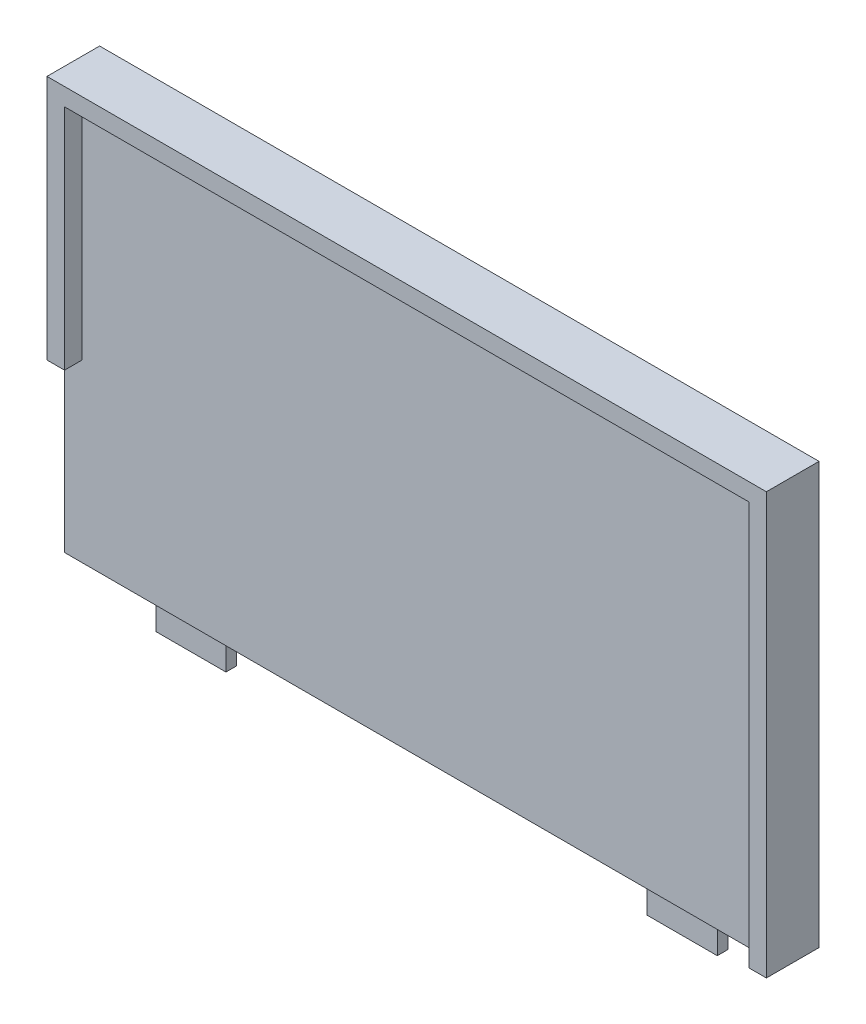
ISO-10303-21;
HEADER;
FILE_DESCRIPTION(('STEP AP214'),'2;1');
FILE_NAME('part.step','',(''),(''),'','','');
FILE_SCHEMA(('AUTOMOTIVE_DESIGN { 1 0 10303 214 1 1 1 1 }'));
ENDSEC;
DATA;
#1=APPLICATION_CONTEXT('core data for automotive mechanical design processes');
#2=APPLICATION_PROTOCOL_DEFINITION('international standard','automotive_design',2000,#1);
#3=PRODUCT_CONTEXT('',#1,'mechanical');
#4=PRODUCT('Part','Part','',(#3));
#5=PRODUCT_RELATED_PRODUCT_CATEGORY('part','',(#4));
#6=PRODUCT_DEFINITION_FORMATION('','',#4);
#7=PRODUCT_DEFINITION_CONTEXT('part definition',#1,'design');
#8=PRODUCT_DEFINITION('design','',#6,#7);
#9=PRODUCT_DEFINITION_SHAPE('','',#8);
#10=(LENGTH_UNIT() NAMED_UNIT(*) SI_UNIT(.MILLI.,.METRE.));
#11=(NAMED_UNIT(*) PLANE_ANGLE_UNIT() SI_UNIT($,.RADIAN.));
#12=(NAMED_UNIT(*) SI_UNIT($,.STERADIAN.) SOLID_ANGLE_UNIT());
#13=UNCERTAINTY_MEASURE_WITH_UNIT(LENGTH_MEASURE(1.E-05),#10,'distance_accuracy_value','');
#14=(GEOMETRIC_REPRESENTATION_CONTEXT(3) GLOBAL_UNCERTAINTY_ASSIGNED_CONTEXT((#13)) GLOBAL_UNIT_ASSIGNED_CONTEXT((#10,
#11,#12)) REPRESENTATION_CONTEXT('',''));
#15=CARTESIAN_POINT('',(0.,0.,0.));
#16=DIRECTION('',(0.,0.,1.));
#17=DIRECTION('',(1.,0.,0.));
#18=AXIS2_PLACEMENT_3D('',#15,#16,#17);
#19=CARTESIAN_POINT('',(102.5,-60.,10.));
#20=DIRECTION('',(0.,1.,0.));
#21=DIRECTION('',(0.,0.,1.));
#22=AXIS2_PLACEMENT_3D('',#19,#20,#21);
#23=PLANE('',#22);
#24=DIRECTION('',(0.,0.,1.));
#25=VECTOR('',#24,1.);
#26=CARTESIAN_POINT('',(80.,-60.,3.49633402895119));
#27=LINE('',#26,#25);
#28=CARTESIAN_POINT('',(80.,-60.,3.49633402895119));
#29=VERTEX_POINT('',#28);
#30=CARTESIAN_POINT('',(79.9999999999999,-60.,6.49633402895119));
#31=VERTEX_POINT('',#30);
#32=EDGE_CURVE('E235',#29,#31,#27,.T.);
#33=ORIENTED_EDGE('',*,*,#32,.F.);
#34=DIRECTION('',(1.,0.,0.));
#35=VECTOR('',#34,1.);
#36=CARTESIAN_POINT('',(80.,-60.,3.49633402895119));
#37=LINE('',#36,#35);
#38=CARTESIAN_POINT('',(60.,-60.,3.49633402895119));
#39=VERTEX_POINT('',#38);
#40=EDGE_CURVE('E224',#39,#29,#37,.T.);
#41=ORIENTED_EDGE('',*,*,#40,.F.);
#42=DIRECTION('',(0.,0.,-1.));
#43=VECTOR('',#42,1.);
#44=CARTESIAN_POINT('',(60.,-60.,3.49633402895119));
#45=LINE('',#44,#43);
#46=CARTESIAN_POINT('',(60.,-60.,6.49633402895119));
#47=VERTEX_POINT('',#46);
#48=EDGE_CURVE('E228',#47,#39,#45,.T.);
#49=ORIENTED_EDGE('',*,*,#48,.F.);
#50=DIRECTION('',(-1.,0.,0.));
#51=VECTOR('',#50,1.);
#52=CARTESIAN_POINT('',(79.9999999999999,-60.,6.49633402895119));
#53=LINE('',#52,#51);
#54=EDGE_CURVE('E229',#31,#47,#53,.T.);
#55=ORIENTED_EDGE('',*,*,#54,.F.);
#56=EDGE_LOOP('',(#33,#41,#49,#55));
#57=FACE_BOUND('',#56,.T.);
#58=DIRECTION('',(1.,0.,0.));
#59=VECTOR('',#58,1.);
#60=CARTESIAN_POINT('',(102.5,-60.,0.));
#61=LINE('',#60,#59);
#62=CARTESIAN_POINT('',(-102.5,-60.,0.));
#63=VERTEX_POINT('',#62);
#64=CARTESIAN_POINT('',(102.5,-60.,0.));
#65=VERTEX_POINT('',#64);
#66=EDGE_CURVE('E328',#63,#65,#61,.T.);
#67=ORIENTED_EDGE('',*,*,#66,.T.);
#68=DIRECTION('',(0.,0.,-1.));
#69=VECTOR('',#68,1.);
#70=CARTESIAN_POINT('',(102.5,-60.,10.));
#71=LINE('',#70,#69);
#72=CARTESIAN_POINT('',(102.5,-60.,15.));
#73=VERTEX_POINT('',#72);
#74=EDGE_CURVE('E331',#73,#65,#71,.T.);
#75=ORIENTED_EDGE('',*,*,#74,.F.);
#76=DIRECTION('',(1.,0.,0.));
#77=VECTOR('',#76,1.);
#78=CARTESIAN_POINT('',(102.5,-60.,15.));
#79=LINE('',#78,#77);
#80=CARTESIAN_POINT('',(97.5,-60.,15.));
#81=VERTEX_POINT('',#80);
#82=EDGE_CURVE('E287',#81,#73,#79,.T.);
#83=ORIENTED_EDGE('',*,*,#82,.F.);
#84=DIRECTION('',(0.,0.,-1.));
#85=VECTOR('',#84,1.);
#86=CARTESIAN_POINT('',(97.5,-60.,15.));
#87=LINE('',#86,#85);
#88=CARTESIAN_POINT('',(97.5,-60.,10.));
#89=VERTEX_POINT('',#88);
#90=EDGE_CURVE('E291',#81,#89,#87,.T.);
#91=ORIENTED_EDGE('',*,*,#90,.T.);
#92=DIRECTION('',(1.,0.,0.));
#93=VECTOR('',#92,1.);
#94=CARTESIAN_POINT('',(102.5,-60.,10.));
#95=LINE('',#94,#93);
#96=CARTESIAN_POINT('',(-102.5,-60.,10.));
#97=VERTEX_POINT('',#96);
#98=EDGE_CURVE('E321',#97,#89,#95,.T.);
#99=ORIENTED_EDGE('',*,*,#98,.F.);
#100=DIRECTION('',(0.,0.,-1.));
#101=VECTOR('',#100,1.);
#102=CARTESIAN_POINT('',(-102.5,-60.,10.));
#103=LINE('',#102,#101);
#104=EDGE_CURVE('E50',#97,#63,#103,.T.);
#105=ORIENTED_EDGE('',*,*,#104,.T.);
#106=EDGE_LOOP('',(#67,#75,#83,#91,#99,#105));
#107=FACE_BOUND('',#106,.T.);
#108=DIRECTION('',(0.,0.,1.));
#109=VECTOR('',#108,1.);
#110=CARTESIAN_POINT('',(-60.,-60.,3.49633402895075));
#111=LINE('',#110,#109);
#112=CARTESIAN_POINT('',(-60.,-60.,3.49633402895075));
#113=VERTEX_POINT('',#112);
#114=CARTESIAN_POINT('',(-60.,-60.,6.49633402895075));
#115=VERTEX_POINT('',#114);
#116=EDGE_CURVE('E53',#113,#115,#111,.T.);
#117=ORIENTED_EDGE('',*,*,#116,.F.);
#118=DIRECTION('',(1.,0.,0.));
#119=VECTOR('',#118,1.);
#120=CARTESIAN_POINT('',(-80.,-60.,3.49633402895075));
#121=LINE('',#120,#119);
#122=CARTESIAN_POINT('',(-80.,-60.,3.49633402895075));
#123=VERTEX_POINT('',#122);
#124=EDGE_CURVE('E59',#123,#113,#121,.T.);
#125=ORIENTED_EDGE('',*,*,#124,.F.);
#126=DIRECTION('',(0.,0.,-1.));
#127=VECTOR('',#126,1.);
#128=CARTESIAN_POINT('',(-80.,-60.,3.49633402895075));
#129=LINE('',#128,#127);
#130=CARTESIAN_POINT('',(-80.,-60.,6.49633402895075));
#131=VERTEX_POINT('',#130);
#132=EDGE_CURVE('E624',#131,#123,#129,.T.);
#133=ORIENTED_EDGE('',*,*,#132,.F.);
#134=DIRECTION('',(-1.,0.,0.));
#135=VECTOR('',#134,1.);
#136=CARTESIAN_POINT('',(-80.,-60.,6.49633402895075));
#137=LINE('',#136,#135);
#138=EDGE_CURVE('E629',#115,#131,#137,.T.);
#139=ORIENTED_EDGE('',*,*,#138,.F.);
#140=EDGE_LOOP('',(#117,#125,#133,#139));
#141=FACE_BOUND('',#140,.T.);
#142=ADVANCED_FACE('F39',(#57,#107,#141),#23,.F.);
#143=CARTESIAN_POINT('',(0.,0.,10.));
#144=DIRECTION('',(0.,0.,-1.));
#145=DIRECTION('',(-1.,0.,0.));
#146=AXIS2_PLACEMENT_3D('',#143,#144,#145);
#147=PLANE('',#146);
#148=DIRECTION('',(0.,-1.,0.));
#149=VECTOR('',#148,1.);
#150=CARTESIAN_POINT('',(97.5,-60.,10.));
#151=LINE('',#150,#149);
#152=CARTESIAN_POINT('',(97.5,55.,10.));
#153=VERTEX_POINT('',#152);
#154=EDGE_CURVE('E280',#153,#89,#151,.T.);
#155=ORIENTED_EDGE('',*,*,#154,.F.);
#156=DIRECTION('',(1.,0.,0.));
#157=VECTOR('',#156,1.);
#158=CARTESIAN_POINT('',(97.5,55.,10.));
#159=LINE('',#158,#157);
#160=CARTESIAN_POINT('',(-97.4999999999999,55.,10.));
#161=VERTEX_POINT('',#160);
#162=EDGE_CURVE('E297',#161,#153,#159,.T.);
#163=ORIENTED_EDGE('',*,*,#162,.F.);
#164=DIRECTION('',(0.,1.,0.));
#165=VECTOR('',#164,1.);
#166=CARTESIAN_POINT('',(-97.5,-10.,10.));
#167=LINE('',#166,#165);
#168=CARTESIAN_POINT('',(-97.5,-10.,10.));
#169=VERTEX_POINT('',#168);
#170=EDGE_CURVE('E298',#169,#161,#167,.T.);
#171=ORIENTED_EDGE('',*,*,#170,.F.);
#172=DIRECTION('',(1.,0.,0.));
#173=VECTOR('',#172,1.);
#174=CARTESIAN_POINT('',(-102.5,-10.,10.));
#175=LINE('',#174,#173);
#176=CARTESIAN_POINT('',(-102.5,-10.,10.));
#177=VERTEX_POINT('',#176);
#178=EDGE_CURVE('E266',#177,#169,#175,.T.);
#179=ORIENTED_EDGE('',*,*,#178,.F.);
#180=DIRECTION('',(0.,-1.,0.));
#181=VECTOR('',#180,1.);
#182=CARTESIAN_POINT('',(-102.5,-60.,10.));
#183=LINE('',#182,#181);
#184=EDGE_CURVE('E317',#177,#97,#183,.T.);
#185=ORIENTED_EDGE('',*,*,#184,.T.);
#186=ORIENTED_EDGE('',*,*,#98,.T.);
#187=EDGE_LOOP('',(#155,#163,#171,#179,#185,#186));
#188=FACE_BOUND('',#187,.T.);
#189=ADVANCED_FACE('F362',(#188),#147,.F.);
#190=CARTESIAN_POINT('',(102.5,60.,10.));
#191=DIRECTION('',(0.,-1.,0.));
#192=DIRECTION('',(0.,0.,-1.));
#193=AXIS2_PLACEMENT_3D('',#190,#191,#192);
#194=PLANE('',#193);
#195=DIRECTION('',(-1.,0.,0.));
#196=VECTOR('',#195,1.);
#197=CARTESIAN_POINT('',(102.5,60.,0.));
#198=LINE('',#197,#196);
#199=CARTESIAN_POINT('',(102.5,60.,0.));
#200=VERTEX_POINT('',#199);
#201=CARTESIAN_POINT('',(-102.5,60.,0.));
#202=VERTEX_POINT('',#201);
#203=EDGE_CURVE('E318',#200,#202,#198,.T.);
#204=ORIENTED_EDGE('',*,*,#203,.T.);
#205=DIRECTION('',(0.,0.,-1.));
#206=VECTOR('',#205,1.);
#207=CARTESIAN_POINT('',(-102.5,60.,10.));
#208=LINE('',#207,#206);
#209=CARTESIAN_POINT('',(-102.5,60.,15.));
#210=VERTEX_POINT('',#209);
#211=EDGE_CURVE('E11',#210,#202,#208,.T.);
#212=ORIENTED_EDGE('',*,*,#211,.F.);
#213=DIRECTION('',(-1.,0.,0.));
#214=VECTOR('',#213,1.);
#215=CARTESIAN_POINT('',(-102.5,60.,15.));
#216=LINE('',#215,#214);
#217=CARTESIAN_POINT('',(102.5,60.,15.));
#218=VERTEX_POINT('',#217);
#219=EDGE_CURVE('E277',#218,#210,#216,.T.);
#220=ORIENTED_EDGE('',*,*,#219,.F.);
#221=DIRECTION('',(0.,0.,-1.));
#222=VECTOR('',#221,1.);
#223=CARTESIAN_POINT('',(102.5,60.,10.));
#224=LINE('',#223,#222);
#225=EDGE_CURVE('E322',#218,#200,#224,.T.);
#226=ORIENTED_EDGE('',*,*,#225,.T.);
#227=EDGE_LOOP('',(#204,#212,#220,#226));
#228=FACE_BOUND('',#227,.T.);
#229=ADVANCED_FACE('F41',(#228),#194,.F.);
#230=CARTESIAN_POINT('',(-102.5,-60.,10.));
#231=DIRECTION('',(1.,0.,0.));
#232=DIRECTION('',(0.,0.,-1.));
#233=AXIS2_PLACEMENT_3D('',#230,#231,#232);
#234=PLANE('',#233);
#235=DIRECTION('',(0.,1.,0.));
#236=VECTOR('',#235,1.);
#237=CARTESIAN_POINT('',(-102.5,-19.75,6.75));
#238=LINE('',#237,#236);
#239=CARTESIAN_POINT('',(-102.5,-40.25,6.75));
#240=VERTEX_POINT('',#239);
#241=CARTESIAN_POINT('',(-102.5,-19.75,6.75));
#242=VERTEX_POINT('',#241);
#243=EDGE_CURVE('E204',#240,#242,#238,.T.);
#244=ORIENTED_EDGE('',*,*,#243,.F.);
#245=DIRECTION('',(0.,0.,1.));
#246=VECTOR('',#245,1.);
#247=CARTESIAN_POINT('',(-102.5,-40.25,3.25));
#248=LINE('',#247,#246);
#249=CARTESIAN_POINT('',(-102.5,-40.25,3.25));
#250=VERTEX_POINT('',#249);
#251=EDGE_CURVE('E205',#250,#240,#248,.T.);
#252=ORIENTED_EDGE('',*,*,#251,.F.);
#253=DIRECTION('',(0.,-1.,0.));
#254=VECTOR('',#253,1.);
#255=CARTESIAN_POINT('',(-102.5,-19.75,3.25));
#256=LINE('',#255,#254);
#257=CARTESIAN_POINT('',(-102.5,-19.75,3.25));
#258=VERTEX_POINT('',#257);
#259=EDGE_CURVE('E246',#258,#250,#256,.T.);
#260=ORIENTED_EDGE('',*,*,#259,.F.);
#261=DIRECTION('',(0.,0.,-1.));
#262=VECTOR('',#261,1.);
#263=CARTESIAN_POINT('',(-102.5,-19.75,3.25));
#264=LINE('',#263,#262);
#265=EDGE_CURVE('E259',#242,#258,#264,.T.);
#266=ORIENTED_EDGE('',*,*,#265,.F.);
#267=EDGE_LOOP('',(#244,#252,#260,#266));
#268=FACE_BOUND('',#267,.T.);
#269=DIRECTION('',(0.,-1.,0.));
#270=VECTOR('',#269,1.);
#271=CARTESIAN_POINT('',(-102.5,-60.,0.));
#272=LINE('',#271,#270);
#273=EDGE_CURVE('E330',#202,#63,#272,.T.);
#274=ORIENTED_EDGE('',*,*,#273,.T.);
#275=ORIENTED_EDGE('',*,*,#104,.F.);
#276=ORIENTED_EDGE('',*,*,#184,.F.);
#277=DIRECTION('',(0.,0.,-1.));
#278=VECTOR('',#277,1.);
#279=CARTESIAN_POINT('',(-102.5,-10.,15.));
#280=LINE('',#279,#278);
#281=CARTESIAN_POINT('',(-102.5,-10.,15.));
#282=VERTEX_POINT('',#281);
#283=EDGE_CURVE('E312',#282,#177,#280,.T.);
#284=ORIENTED_EDGE('',*,*,#283,.F.);
#285=DIRECTION('',(0.,-1.,0.));
#286=VECTOR('',#285,1.);
#287=CARTESIAN_POINT('',(-102.5,60.,15.));
#288=LINE('',#287,#286);
#289=EDGE_CURVE('E278',#210,#282,#288,.T.);
#290=ORIENTED_EDGE('',*,*,#289,.F.);
#291=ORIENTED_EDGE('',*,*,#211,.T.);
#292=EDGE_LOOP('',(#274,#275,#276,#284,#290,#291));
#293=FACE_BOUND('',#292,.T.);
#294=ADVANCED_FACE('F374',(#268,#293),#234,.F.);
#295=CARTESIAN_POINT('',(102.5,-60.,10.));
#296=DIRECTION('',(-1.,0.,0.));
#297=DIRECTION('',(0.,0.,1.));
#298=AXIS2_PLACEMENT_3D('',#295,#296,#297);
#299=PLANE('',#298);
#300=DIRECTION('',(0.,1.,0.));
#301=VECTOR('',#300,1.);
#302=CARTESIAN_POINT('',(102.5,-60.,0.));
#303=LINE('',#302,#301);
#304=EDGE_CURVE('E325',#65,#200,#303,.T.);
#305=ORIENTED_EDGE('',*,*,#304,.T.);
#306=ORIENTED_EDGE('',*,*,#225,.F.);
#307=DIRECTION('',(0.,1.,0.));
#308=VECTOR('',#307,1.);
#309=CARTESIAN_POINT('',(102.5,60.,15.));
#310=LINE('',#309,#308);
#311=EDGE_CURVE('E272',#73,#218,#310,.T.);
#312=ORIENTED_EDGE('',*,*,#311,.F.);
#313=ORIENTED_EDGE('',*,*,#74,.T.);
#314=EDGE_LOOP('',(#305,#306,#312,#313));
#315=FACE_BOUND('',#314,.T.);
#316=ADVANCED_FACE('F346',(#315),#299,.F.);
#317=CARTESIAN_POINT('',(0.,0.,0.));
#318=DIRECTION('',(0.,0.,-1.));
#319=DIRECTION('',(-1.,0.,0.));
#320=AXIS2_PLACEMENT_3D('',#317,#318,#319);
#321=PLANE('',#320);
#322=ORIENTED_EDGE('',*,*,#203,.F.);
#323=ORIENTED_EDGE('',*,*,#304,.F.);
#324=ORIENTED_EDGE('',*,*,#66,.F.);
#325=ORIENTED_EDGE('',*,*,#273,.F.);
#326=EDGE_LOOP('',(#322,#323,#324,#325));
#327=FACE_BOUND('',#326,.T.);
#328=ADVANCED_FACE('F347',(#327),#321,.T.);
#329=CARTESIAN_POINT('',(-102.5,-10.,15.));
#330=DIRECTION('',(0.,1.,0.));
#331=DIRECTION('',(0.,0.,1.));
#332=AXIS2_PLACEMENT_3D('',#329,#330,#331);
#333=PLANE('',#332);
#334=ORIENTED_EDGE('',*,*,#178,.T.);
#335=DIRECTION('',(0.,0.,-1.));
#336=VECTOR('',#335,1.);
#337=CARTESIAN_POINT('',(-97.5,-10.,15.));
#338=LINE('',#337,#336);
#339=CARTESIAN_POINT('',(-97.5,-10.,15.));
#340=VERTEX_POINT('',#339);
#341=EDGE_CURVE('E315',#340,#169,#338,.T.);
#342=ORIENTED_EDGE('',*,*,#341,.F.);
#343=DIRECTION('',(1.,0.,0.));
#344=VECTOR('',#343,1.);
#345=CARTESIAN_POINT('',(-102.5,-10.,15.));
#346=LINE('',#345,#344);
#347=EDGE_CURVE('E285',#282,#340,#346,.T.);
#348=ORIENTED_EDGE('',*,*,#347,.F.);
#349=ORIENTED_EDGE('',*,*,#283,.T.);
#350=EDGE_LOOP('',(#334,#342,#348,#349));
#351=FACE_BOUND('',#350,.T.);
#352=ADVANCED_FACE('F375',(#351),#333,.F.);
#353=CARTESIAN_POINT('',(-97.5,-10.,15.));
#354=DIRECTION('',(-1.,0.,0.));
#355=DIRECTION('',(0.,-1.,0.));
#356=AXIS2_PLACEMENT_3D('',#353,#354,#355);
#357=PLANE('',#356);
#358=ORIENTED_EDGE('',*,*,#170,.T.);
#359=DIRECTION('',(0.,0.,-1.));
#360=VECTOR('',#359,1.);
#361=CARTESIAN_POINT('',(-97.4999999999999,55.,15.));
#362=LINE('',#361,#360);
#363=CARTESIAN_POINT('',(-97.4999999999999,55.,15.));
#364=VERTEX_POINT('',#363);
#365=EDGE_CURVE('E310',#364,#161,#362,.T.);
#366=ORIENTED_EDGE('',*,*,#365,.F.);
#367=DIRECTION('',(0.,1.,0.));
#368=VECTOR('',#367,1.);
#369=CARTESIAN_POINT('',(-97.5,-10.,15.));
#370=LINE('',#369,#368);
#371=EDGE_CURVE('E282',#340,#364,#370,.T.);
#372=ORIENTED_EDGE('',*,*,#371,.F.);
#373=ORIENTED_EDGE('',*,*,#341,.T.);
#374=EDGE_LOOP('',(#358,#366,#372,#373));
#375=FACE_BOUND('',#374,.T.);
#376=ADVANCED_FACE('F369',(#375),#357,.F.);
#377=CARTESIAN_POINT('',(97.5,55.,15.));
#378=DIRECTION('',(0.,1.,0.));
#379=DIRECTION('',(-1.,0.,0.));
#380=AXIS2_PLACEMENT_3D('',#377,#378,#379);
#381=PLANE('',#380);
#382=ORIENTED_EDGE('',*,*,#162,.T.);
#383=DIRECTION('',(0.,0.,-1.));
#384=VECTOR('',#383,1.);
#385=CARTESIAN_POINT('',(97.5,55.,15.));
#386=LINE('',#385,#384);
#387=CARTESIAN_POINT('',(97.5,55.,15.));
#388=VERTEX_POINT('',#387);
#389=EDGE_CURVE('E308',#388,#153,#386,.T.);
#390=ORIENTED_EDGE('',*,*,#389,.F.);
#391=DIRECTION('',(1.,0.,0.));
#392=VECTOR('',#391,1.);
#393=CARTESIAN_POINT('',(97.5,55.,15.));
#394=LINE('',#393,#392);
#395=EDGE_CURVE('E289',#364,#388,#394,.T.);
#396=ORIENTED_EDGE('',*,*,#395,.F.);
#397=ORIENTED_EDGE('',*,*,#365,.T.);
#398=EDGE_LOOP('',(#382,#390,#396,#397));
#399=FACE_BOUND('',#398,.T.);
#400=ADVANCED_FACE('F365',(#399),#381,.F.);
#401=CARTESIAN_POINT('',(97.5,-60.,15.));
#402=DIRECTION('',(1.,0.,0.));
#403=DIRECTION('',(0.,0.,-1.));
#404=AXIS2_PLACEMENT_3D('',#401,#402,#403);
#405=PLANE('',#404);
#406=ORIENTED_EDGE('',*,*,#154,.T.);
#407=ORIENTED_EDGE('',*,*,#90,.F.);
#408=DIRECTION('',(0.,-1.,0.));
#409=VECTOR('',#408,1.);
#410=CARTESIAN_POINT('',(97.5,-60.,15.));
#411=LINE('',#410,#409);
#412=EDGE_CURVE('E290',#388,#81,#411,.T.);
#413=ORIENTED_EDGE('',*,*,#412,.F.);
#414=ORIENTED_EDGE('',*,*,#389,.T.);
#415=EDGE_LOOP('',(#406,#407,#413,#414));
#416=FACE_BOUND('',#415,.T.);
#417=ADVANCED_FACE('F358',(#416),#405,.F.);
#418=CARTESIAN_POINT('',(0.,0.,15.));
#419=DIRECTION('',(0.,0.,-1.));
#420=DIRECTION('',(-1.,0.,0.));
#421=AXIS2_PLACEMENT_3D('',#418,#419,#420);
#422=PLANE('',#421);
#423=ORIENTED_EDGE('',*,*,#311,.T.);
#424=ORIENTED_EDGE('',*,*,#219,.T.);
#425=ORIENTED_EDGE('',*,*,#289,.T.);
#426=ORIENTED_EDGE('',*,*,#347,.T.);
#427=ORIENTED_EDGE('',*,*,#371,.T.);
#428=ORIENTED_EDGE('',*,*,#395,.T.);
#429=ORIENTED_EDGE('',*,*,#412,.T.);
#430=ORIENTED_EDGE('',*,*,#82,.T.);
#431=EDGE_LOOP('',(#423,#424,#425,#426,#427,#428,#429,#430));
#432=FACE_BOUND('',#431,.T.);
#433=ADVANCED_FACE('F352',(#432),#422,.F.);
#434=CARTESIAN_POINT('',(-92.5,-40.25,3.25));
#435=DIRECTION('',(0.,-1.,0.));
#436=DIRECTION('',(0.,0.,-1.));
#437=AXIS2_PLACEMENT_3D('',#434,#435,#436);
#438=PLANE('',#437);
#439=ORIENTED_EDGE('',*,*,#251,.T.);
#440=DIRECTION('',(-1.,0.,0.));
#441=VECTOR('',#440,1.);
#442=CARTESIAN_POINT('',(-92.5,-40.25,6.75));
#443=LINE('',#442,#441);
#444=CARTESIAN_POINT('',(-92.5,-40.25,6.75));
#445=VERTEX_POINT('',#444);
#446=EDGE_CURVE('E254',#445,#240,#443,.T.);
#447=ORIENTED_EDGE('',*,*,#446,.F.);
#448=DIRECTION('',(0.,0.,1.));
#449=VECTOR('',#448,1.);
#450=CARTESIAN_POINT('',(-92.5,-40.25,3.25));
#451=LINE('',#450,#449);
#452=CARTESIAN_POINT('',(-92.5,-40.25,3.25));
#453=VERTEX_POINT('',#452);
#454=EDGE_CURVE('E241',#453,#445,#451,.T.);
#455=ORIENTED_EDGE('',*,*,#454,.F.);
#456=DIRECTION('',(-1.,0.,0.));
#457=VECTOR('',#456,1.);
#458=CARTESIAN_POINT('',(-92.5,-40.25,3.25));
#459=LINE('',#458,#457);
#460=EDGE_CURVE('E262',#453,#250,#459,.T.);
#461=ORIENTED_EDGE('',*,*,#460,.T.);
#462=EDGE_LOOP('',(#439,#447,#455,#461));
#463=FACE_BOUND('',#462,.T.);
#464=ADVANCED_FACE('F410',(#463),#438,.F.);
#465=CARTESIAN_POINT('',(-92.5,-19.75,3.25));
#466=DIRECTION('',(0.,0.,-1.));
#467=DIRECTION('',(-1.,0.,0.));
#468=AXIS2_PLACEMENT_3D('',#465,#466,#467);
#469=PLANE('',#468);
#470=ORIENTED_EDGE('',*,*,#259,.T.);
#471=ORIENTED_EDGE('',*,*,#460,.F.);
#472=DIRECTION('',(0.,-1.,0.));
#473=VECTOR('',#472,1.);
#474=CARTESIAN_POINT('',(-92.5,-19.75,3.25));
#475=LINE('',#474,#473);
#476=CARTESIAN_POINT('',(-92.5,-19.75,3.25));
#477=VERTEX_POINT('',#476);
#478=EDGE_CURVE('E251',#477,#453,#475,.T.);
#479=ORIENTED_EDGE('',*,*,#478,.F.);
#480=DIRECTION('',(-1.,0.,0.));
#481=VECTOR('',#480,1.);
#482=CARTESIAN_POINT('',(-92.5,-19.75,3.25));
#483=LINE('',#482,#481);
#484=EDGE_CURVE('E270',#477,#258,#483,.T.);
#485=ORIENTED_EDGE('',*,*,#484,.T.);
#486=EDGE_LOOP('',(#470,#471,#479,#485));
#487=FACE_BOUND('',#486,.T.);
#488=ADVANCED_FACE('F407',(#487),#469,.F.);
#489=CARTESIAN_POINT('',(-92.5,-19.75,3.25));
#490=DIRECTION('',(0.,1.,0.));
#491=DIRECTION('',(0.,0.,1.));
#492=AXIS2_PLACEMENT_3D('',#489,#490,#491);
#493=PLANE('',#492);
#494=ORIENTED_EDGE('',*,*,#265,.T.);
#495=ORIENTED_EDGE('',*,*,#484,.F.);
#496=DIRECTION('',(0.,0.,-1.));
#497=VECTOR('',#496,1.);
#498=CARTESIAN_POINT('',(-92.5,-19.75,3.25));
#499=LINE('',#498,#497);
#500=CARTESIAN_POINT('',(-92.5,-19.75,6.75));
#501=VERTEX_POINT('',#500);
#502=EDGE_CURVE('E247',#501,#477,#499,.T.);
#503=ORIENTED_EDGE('',*,*,#502,.F.);
#504=DIRECTION('',(-1.,0.,0.));
#505=VECTOR('',#504,1.);
#506=CARTESIAN_POINT('',(-92.5,-19.75,6.75));
#507=LINE('',#506,#505);
#508=EDGE_CURVE('E267',#501,#242,#507,.T.);
#509=ORIENTED_EDGE('',*,*,#508,.T.);
#510=EDGE_LOOP('',(#494,#495,#503,#509));
#511=FACE_BOUND('',#510,.T.);
#512=ADVANCED_FACE('F412',(#511),#493,.F.);
#513=CARTESIAN_POINT('',(-92.5,-19.75,6.75));
#514=DIRECTION('',(0.,0.,1.));
#515=DIRECTION('',(1.,0.,0.));
#516=AXIS2_PLACEMENT_3D('',#513,#514,#515);
#517=PLANE('',#516);
#518=ORIENTED_EDGE('',*,*,#243,.T.);
#519=ORIENTED_EDGE('',*,*,#508,.F.);
#520=DIRECTION('',(0.,1.,0.));
#521=VECTOR('',#520,1.);
#522=CARTESIAN_POINT('',(-92.5,-19.75,6.75));
#523=LINE('',#522,#521);
#524=EDGE_CURVE('E249',#445,#501,#523,.T.);
#525=ORIENTED_EDGE('',*,*,#524,.F.);
#526=ORIENTED_EDGE('',*,*,#446,.T.);
#527=EDGE_LOOP('',(#518,#519,#525,#526));
#528=FACE_BOUND('',#527,.T.);
#529=ADVANCED_FACE('F414',(#528),#517,.F.);
#530=CARTESIAN_POINT('',(-92.5,0.,0.));
#531=DIRECTION('',(1.,0.,0.));
#532=DIRECTION('',(0.,0.,-1.));
#533=AXIS2_PLACEMENT_3D('',#530,#531,#532);
#534=PLANE('',#533);
#535=ORIENTED_EDGE('',*,*,#454,.T.);
#536=ORIENTED_EDGE('',*,*,#524,.T.);
#537=ORIENTED_EDGE('',*,*,#502,.T.);
#538=ORIENTED_EDGE('',*,*,#478,.T.);
#539=EDGE_LOOP('',(#535,#536,#537,#538));
#540=FACE_BOUND('',#539,.T.);
#541=ADVANCED_FACE('F413',(#540),#534,.F.);
#542=CARTESIAN_POINT('',(80.,-70.,3.49633402895119));
#543=DIRECTION('',(-1.,0.,0.));
#544=DIRECTION('',(0.,0.,1.));
#545=AXIS2_PLACEMENT_3D('',#542,#543,#544);
#546=PLANE('',#545);
#547=ORIENTED_EDGE('',*,*,#32,.T.);
#548=DIRECTION('',(0.,1.,0.));
#549=VECTOR('',#548,1.);
#550=CARTESIAN_POINT('',(79.9999999999999,-70.,6.49633402895119));
#551=LINE('',#550,#549);
#552=CARTESIAN_POINT('',(79.9999999999999,-70.,6.49633402895119));
#553=VERTEX_POINT('',#552);
#554=EDGE_CURVE('E209',#553,#31,#551,.T.);
#555=ORIENTED_EDGE('',*,*,#554,.F.);
#556=DIRECTION('',(0.,0.,1.));
#557=VECTOR('',#556,1.);
#558=CARTESIAN_POINT('',(80.,-70.,3.49633402895119));
#559=LINE('',#558,#557);
#560=CARTESIAN_POINT('',(80.,-70.,3.49633402895119));
#561=VERTEX_POINT('',#560);
#562=EDGE_CURVE('E230',#561,#553,#559,.T.);
#563=ORIENTED_EDGE('',*,*,#562,.F.);
#564=DIRECTION('',(0.,1.,0.));
#565=VECTOR('',#564,1.);
#566=CARTESIAN_POINT('',(80.,-70.,3.49633402895119));
#567=LINE('',#566,#565);
#568=EDGE_CURVE('E218',#561,#29,#567,.T.);
#569=ORIENTED_EDGE('',*,*,#568,.T.);
#570=EDGE_LOOP('',(#547,#555,#563,#569));
#571=FACE_BOUND('',#570,.T.);
#572=ADVANCED_FACE('F424',(#571),#546,.F.);
#573=CARTESIAN_POINT('',(79.9999999999999,-70.,6.49633402895119));
#574=DIRECTION('',(0.,0.,-1.));
#575=DIRECTION('',(-1.,0.,0.));
#576=AXIS2_PLACEMENT_3D('',#573,#574,#575);
#577=PLANE('',#576);
#578=ORIENTED_EDGE('',*,*,#54,.T.);
#579=DIRECTION('',(0.,1.,0.));
#580=VECTOR('',#579,1.);
#581=CARTESIAN_POINT('',(60.,-70.,6.49633402895119));
#582=LINE('',#581,#580);
#583=CARTESIAN_POINT('',(60.,-70.,6.49633402895119));
#584=VERTEX_POINT('',#583);
#585=EDGE_CURVE('E213',#584,#47,#582,.T.);
#586=ORIENTED_EDGE('',*,*,#585,.F.);
#587=DIRECTION('',(-1.,0.,0.));
#588=VECTOR('',#587,1.);
#589=CARTESIAN_POINT('',(79.9999999999999,-70.,6.49633402895119));
#590=LINE('',#589,#588);
#591=EDGE_CURVE('E239',#553,#584,#590,.T.);
#592=ORIENTED_EDGE('',*,*,#591,.F.);
#593=ORIENTED_EDGE('',*,*,#554,.T.);
#594=EDGE_LOOP('',(#578,#586,#592,#593));
#595=FACE_BOUND('',#594,.T.);
#596=ADVANCED_FACE('F440',(#595),#577,.F.);
#597=CARTESIAN_POINT('',(60.,-70.,3.49633402895119));
#598=DIRECTION('',(1.,0.,0.));
#599=DIRECTION('',(0.,0.,-1.));
#600=AXIS2_PLACEMENT_3D('',#597,#598,#599);
#601=PLANE('',#600);
#602=ORIENTED_EDGE('',*,*,#48,.T.);
#603=DIRECTION('',(0.,1.,0.));
#604=VECTOR('',#603,1.);
#605=CARTESIAN_POINT('',(60.,-70.,3.49633402895119));
#606=LINE('',#605,#604);
#607=CARTESIAN_POINT('',(60.,-70.,3.49633402895119));
#608=VERTEX_POINT('',#607);
#609=EDGE_CURVE('E216',#608,#39,#606,.T.);
#610=ORIENTED_EDGE('',*,*,#609,.F.);
#611=DIRECTION('',(0.,0.,-1.));
#612=VECTOR('',#611,1.);
#613=CARTESIAN_POINT('',(60.,-70.,3.49633402895119));
#614=LINE('',#613,#612);
#615=EDGE_CURVE('E240',#584,#608,#614,.T.);
#616=ORIENTED_EDGE('',*,*,#615,.F.);
#617=ORIENTED_EDGE('',*,*,#585,.T.);
#618=EDGE_LOOP('',(#602,#610,#616,#617));
#619=FACE_BOUND('',#618,.T.);
#620=ADVANCED_FACE('F433',(#619),#601,.F.);
#621=CARTESIAN_POINT('',(80.,-70.,3.49633402895119));
#622=DIRECTION('',(0.,0.,1.));
#623=DIRECTION('',(1.,0.,0.));
#624=AXIS2_PLACEMENT_3D('',#621,#622,#623);
#625=PLANE('',#624);
#626=ORIENTED_EDGE('',*,*,#40,.T.);
#627=ORIENTED_EDGE('',*,*,#568,.F.);
#628=DIRECTION('',(1.,0.,0.));
#629=VECTOR('',#628,1.);
#630=CARTESIAN_POINT('',(80.,-70.,3.49633402895119));
#631=LINE('',#630,#629);
#632=EDGE_CURVE('E225',#608,#561,#631,.T.);
#633=ORIENTED_EDGE('',*,*,#632,.F.);
#634=ORIENTED_EDGE('',*,*,#609,.T.);
#635=EDGE_LOOP('',(#626,#627,#633,#634));
#636=FACE_BOUND('',#635,.T.);
#637=ADVANCED_FACE('F427',(#636),#625,.F.);
#638=CARTESIAN_POINT('',(0.,-70.,0.));
#639=DIRECTION('',(0.,-1.,0.));
#640=DIRECTION('',(0.,0.,-1.));
#641=AXIS2_PLACEMENT_3D('',#638,#639,#640);
#642=PLANE('',#641);
#643=ORIENTED_EDGE('',*,*,#562,.T.);
#644=ORIENTED_EDGE('',*,*,#591,.T.);
#645=ORIENTED_EDGE('',*,*,#615,.T.);
#646=ORIENTED_EDGE('',*,*,#632,.T.);
#647=EDGE_LOOP('',(#643,#644,#645,#646));
#648=FACE_BOUND('',#647,.T.);
#649=ADVANCED_FACE('F426',(#648),#642,.T.);
#650=CARTESIAN_POINT('',(-60.,-70.,3.49633402895075));
#651=DIRECTION('',(-1.,0.,0.));
#652=DIRECTION('',(0.,0.,1.));
#653=AXIS2_PLACEMENT_3D('',#650,#651,#652);
#654=PLANE('',#653);
#655=ORIENTED_EDGE('',*,*,#116,.T.);
#656=DIRECTION('',(0.,1.,0.));
#657=VECTOR('',#656,1.);
#658=CARTESIAN_POINT('',(-60.,-70.,6.49633402895075));
#659=LINE('',#658,#657);
#660=CARTESIAN_POINT('',(-60.,-70.,6.49633402895075));
#661=VERTEX_POINT('',#660);
#662=EDGE_CURVE('E183',#661,#115,#659,.T.);
#663=ORIENTED_EDGE('',*,*,#662,.F.);
#664=DIRECTION('',(0.,0.,1.));
#665=VECTOR('',#664,1.);
#666=CARTESIAN_POINT('',(-60.,-70.,3.49633402895075));
#667=LINE('',#666,#665);
#668=CARTESIAN_POINT('',(-60.,-70.,3.49633402895075));
#669=VERTEX_POINT('',#668);
#670=EDGE_CURVE('E194',#669,#661,#667,.T.);
#671=ORIENTED_EDGE('',*,*,#670,.F.);
#672=DIRECTION('',(0.,1.,0.));
#673=VECTOR('',#672,1.);
#674=CARTESIAN_POINT('',(-60.,-70.,3.49633402895075));
#675=LINE('',#674,#673);
#676=EDGE_CURVE('E625',#669,#113,#675,.T.);
#677=ORIENTED_EDGE('',*,*,#676,.T.);
#678=EDGE_LOOP('',(#655,#663,#671,#677));
#679=FACE_BOUND('',#678,.T.);
#680=ADVANCED_FACE('F203',(#679),#654,.F.);
#681=CARTESIAN_POINT('',(-80.,-70.,6.49633402895075));
#682=DIRECTION('',(0.,0.,-1.));
#683=DIRECTION('',(-1.,0.,0.));
#684=AXIS2_PLACEMENT_3D('',#681,#682,#683);
#685=PLANE('',#684);
#686=ORIENTED_EDGE('',*,*,#138,.T.);
#687=DIRECTION('',(0.,1.,0.));
#688=VECTOR('',#687,1.);
#689=CARTESIAN_POINT('',(-80.,-70.,6.49633402895075));
#690=LINE('',#689,#688);
#691=CARTESIAN_POINT('',(-80.,-70.,6.49633402895075));
#692=VERTEX_POINT('',#691);
#693=EDGE_CURVE('E190',#692,#131,#690,.T.);
#694=ORIENTED_EDGE('',*,*,#693,.F.);
#695=DIRECTION('',(-1.,0.,0.));
#696=VECTOR('',#695,1.);
#697=CARTESIAN_POINT('',(-80.,-70.,6.49633402895075));
#698=LINE('',#697,#696);
#699=EDGE_CURVE('E177',#661,#692,#698,.T.);
#700=ORIENTED_EDGE('',*,*,#699,.F.);
#701=ORIENTED_EDGE('',*,*,#662,.T.);
#702=EDGE_LOOP('',(#686,#694,#700,#701));
#703=FACE_BOUND('',#702,.T.);
#704=ADVANCED_FACE('F181',(#703),#685,.F.);
#705=CARTESIAN_POINT('',(-80.,-70.,3.49633402895075));
#706=DIRECTION('',(1.,0.,0.));
#707=DIRECTION('',(0.,0.,-1.));
#708=AXIS2_PLACEMENT_3D('',#705,#706,#707);
#709=PLANE('',#708);
#710=ORIENTED_EDGE('',*,*,#132,.T.);
#711=DIRECTION('',(0.,1.,0.));
#712=VECTOR('',#711,1.);
#713=CARTESIAN_POINT('',(-80.,-70.,3.49633402895075));
#714=LINE('',#713,#712);
#715=CARTESIAN_POINT('',(-80.,-70.,3.49633402895075));
#716=VERTEX_POINT('',#715);
#717=EDGE_CURVE('E206',#716,#123,#714,.T.);
#718=ORIENTED_EDGE('',*,*,#717,.F.);
#719=DIRECTION('',(0.,0.,-1.));
#720=VECTOR('',#719,1.);
#721=CARTESIAN_POINT('',(-80.,-70.,3.49633402895075));
#722=LINE('',#721,#720);
#723=EDGE_CURVE('E189',#692,#716,#722,.T.);
#724=ORIENTED_EDGE('',*,*,#723,.F.);
#725=ORIENTED_EDGE('',*,*,#693,.T.);
#726=EDGE_LOOP('',(#710,#718,#724,#725));
#727=FACE_BOUND('',#726,.T.);
#728=ADVANCED_FACE('F446',(#727),#709,.F.);
#729=CARTESIAN_POINT('',(-80.,-70.,3.49633402895075));
#730=DIRECTION('',(0.,0.,1.));
#731=DIRECTION('',(1.,0.,0.));
#732=AXIS2_PLACEMENT_3D('',#729,#730,#731);
#733=PLANE('',#732);
#734=ORIENTED_EDGE('',*,*,#124,.T.);
#735=ORIENTED_EDGE('',*,*,#676,.F.);
#736=DIRECTION('',(1.,0.,0.));
#737=VECTOR('',#736,1.);
#738=CARTESIAN_POINT('',(-80.,-70.,3.49633402895075));
#739=LINE('',#738,#737);
#740=EDGE_CURVE('E198',#716,#669,#739,.T.);
#741=ORIENTED_EDGE('',*,*,#740,.F.);
#742=ORIENTED_EDGE('',*,*,#717,.T.);
#743=EDGE_LOOP('',(#734,#735,#741,#742));
#744=FACE_BOUND('',#743,.T.);
#745=ADVANCED_FACE('F454',(#744),#733,.F.);
#746=CARTESIAN_POINT('',(0.,-70.,0.));
#747=DIRECTION('',(0.,1.,0.));
#748=DIRECTION('',(0.,0.,1.));
#749=AXIS2_PLACEMENT_3D('',#746,#747,#748);
#750=PLANE('',#749);
#751=ORIENTED_EDGE('',*,*,#670,.T.);
#752=ORIENTED_EDGE('',*,*,#699,.T.);
#753=ORIENTED_EDGE('',*,*,#723,.T.);
#754=ORIENTED_EDGE('',*,*,#740,.T.);
#755=EDGE_LOOP('',(#751,#752,#753,#754));
#756=FACE_BOUND('',#755,.T.);
#757=ADVANCED_FACE('F193',(#756),#750,.F.);
#758=CLOSED_SHELL('',(#142,#189,#229,#294,#316,#328,#352,#376,#400,#417,#433,#464,#488,#512,
#529,#541,#572,#596,#620,#637,#649,#680,#704,#728,#745,#757));
#759=MANIFOLD_SOLID_BREP('B2',#758);
#760=ADVANCED_BREP_SHAPE_REPRESENTATION('',(#18,#759),#14);
#761=SHAPE_DEFINITION_REPRESENTATION(#9,#760);
ENDSEC;
END-ISO-10303-21;
